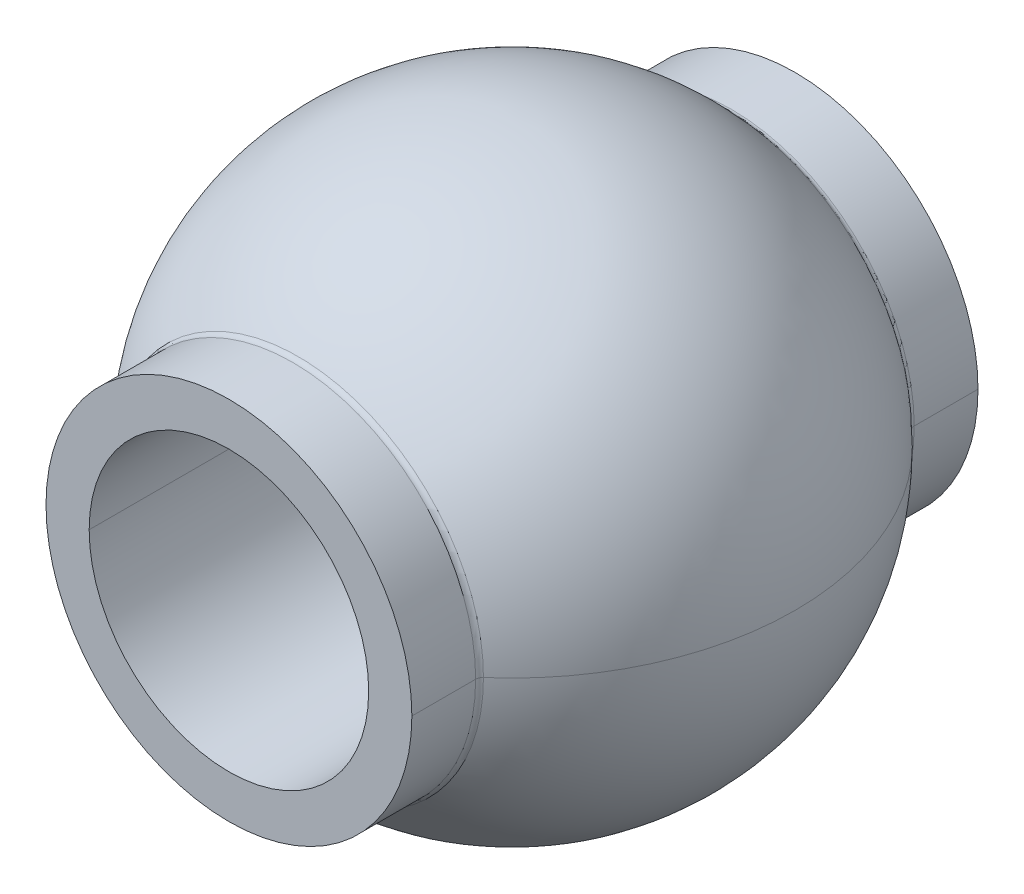
ISO-10303-21;
HEADER;
FILE_DESCRIPTION(('STEP AP214'),'2;1');
FILE_NAME('part.step','',(''),(''),'','','');
FILE_SCHEMA(('AUTOMOTIVE_DESIGN { 1 0 10303 214 1 1 1 1 }'));
ENDSEC;
DATA;
#1=APPLICATION_CONTEXT('core data for automotive mechanical design processes');
#2=APPLICATION_PROTOCOL_DEFINITION('international standard','automotive_design',2000,#1);
#3=PRODUCT_CONTEXT('',#1,'mechanical');
#4=PRODUCT('Part','Part','',(#3));
#5=PRODUCT_RELATED_PRODUCT_CATEGORY('part','',(#4));
#6=PRODUCT_DEFINITION_FORMATION('','',#4);
#7=PRODUCT_DEFINITION_CONTEXT('part definition',#1,'design');
#8=PRODUCT_DEFINITION('design','',#6,#7);
#9=PRODUCT_DEFINITION_SHAPE('','',#8);
#10=(LENGTH_UNIT() NAMED_UNIT(*) SI_UNIT(.MILLI.,.METRE.));
#11=(NAMED_UNIT(*) PLANE_ANGLE_UNIT() SI_UNIT($,.RADIAN.));
#12=(NAMED_UNIT(*) SI_UNIT($,.STERADIAN.) SOLID_ANGLE_UNIT());
#13=UNCERTAINTY_MEASURE_WITH_UNIT(LENGTH_MEASURE(1.E-05),#10,'distance_accuracy_value','');
#14=(GEOMETRIC_REPRESENTATION_CONTEXT(3) GLOBAL_UNCERTAINTY_ASSIGNED_CONTEXT((#13)) GLOBAL_UNIT_ASSIGNED_CONTEXT((#10,
#11,#12)) REPRESENTATION_CONTEXT('',''));
#15=CARTESIAN_POINT('',(0.,0.,0.));
#16=DIRECTION('',(0.,0.,1.));
#17=DIRECTION('',(1.,0.,0.));
#18=AXIS2_PLACEMENT_3D('',#15,#16,#17);
#19=CARTESIAN_POINT('',(0.,0.,-3.09851173952916));
#20=DIRECTION('',(0.,0.,1.));
#21=DIRECTION('',(1.,0.,0.));
#22=AXIS2_PLACEMENT_3D('',#19,#20,#21);
#23=TOROIDAL_SURFACE('',#22,2.685,0.1);
#24=CARTESIAN_POINT('',(0.,0.,-3.02293828246747));
#25=DIRECTION('',(0.,0.,1.));
#26=DIRECTION('',(1.,0.,0.));
#27=AXIS2_PLACEMENT_3D('',#24,#25,#26);
#28=CIRCLE('',#27,2.61951219512195);
#29=CARTESIAN_POINT('',(-2.61951219512195,0.,-3.02293828246747));
#30=VERTEX_POINT('',#29);
#31=CARTESIAN_POINT('',(2.61951219512195,0.,-3.02293828246747));
#32=VERTEX_POINT('',#31);
#33=EDGE_CURVE('E39',#30,#32,#28,.T.);
#34=ORIENTED_EDGE('',*,*,#33,.F.);
#35=CARTESIAN_POINT('',(-2.685,0.,-3.09851173952916));
#36=DIRECTION('',(0.,1.,0.));
#37=DIRECTION('',(-1.,0.,0.));
#38=AXIS2_PLACEMENT_3D('',#35,#36,#37);
#39=CIRCLE('',#38,0.1);
#40=CARTESIAN_POINT('',(-2.585,0.,-3.09851173952916));
#41=VERTEX_POINT('',#40);
#42=EDGE_CURVE('E11',#30,#41,#39,.T.);
#43=ORIENTED_EDGE('',*,*,#42,.T.);
#44=CARTESIAN_POINT('',(0.,0.,-3.09851173952916));
#45=DIRECTION('',(0.,0.,-1.));
#46=DIRECTION('',(1.,0.,0.));
#47=AXIS2_PLACEMENT_3D('',#44,#45,#46);
#48=CIRCLE('',#47,2.585);
#49=CARTESIAN_POINT('',(2.585,0.,-3.09851173952916));
#50=VERTEX_POINT('',#49);
#51=EDGE_CURVE('E20',#50,#41,#48,.T.);
#52=ORIENTED_EDGE('',*,*,#51,.F.);
#53=CARTESIAN_POINT('',(2.685,0.,-3.09851173952916));
#54=DIRECTION('',(0.,-1.,0.));
#55=DIRECTION('',(0.,0.,-1.));
#56=AXIS2_PLACEMENT_3D('',#53,#54,#55);
#57=CIRCLE('',#56,0.1);
#58=EDGE_CURVE('E108',#32,#50,#57,.T.);
#59=ORIENTED_EDGE('',*,*,#58,.F.);
#60=EDGE_LOOP('',(#34,#43,#52,#59));
#61=FACE_BOUND('',#60,.T.);
#62=ADVANCED_FACE('F16',(#61),#23,.F.);
#63=CARTESIAN_POINT('',(0.,0.,3.09851173952916));
#64=DIRECTION('',(0.,0.,-1.));
#65=DIRECTION('',(-1.,0.,0.));
#66=AXIS2_PLACEMENT_3D('',#63,#64,#65);
#67=TOROIDAL_SURFACE('',#66,2.685,0.1);
#68=CARTESIAN_POINT('',(0.,0.,3.02293828246747));
#69=DIRECTION('',(0.,0.,-1.));
#70=DIRECTION('',(-1.,0.,0.));
#71=AXIS2_PLACEMENT_3D('',#68,#69,#70);
#72=CIRCLE('',#71,2.61951219512195);
#73=CARTESIAN_POINT('',(2.61951219512195,0.,3.02293828246747));
#74=VERTEX_POINT('',#73);
#75=CARTESIAN_POINT('',(-2.61951219512195,0.,3.02293828246747));
#76=VERTEX_POINT('',#75);
#77=EDGE_CURVE('E145',#74,#76,#72,.T.);
#78=ORIENTED_EDGE('',*,*,#77,.F.);
#79=CARTESIAN_POINT('',(2.685,0.,3.09851173952916));
#80=DIRECTION('',(0.,1.,0.));
#81=DIRECTION('',(-1.,0.,0.));
#82=AXIS2_PLACEMENT_3D('',#79,#80,#81);
#83=CIRCLE('',#82,0.1);
#84=CARTESIAN_POINT('',(2.585,0.,3.09851173952916));
#85=VERTEX_POINT('',#84);
#86=EDGE_CURVE('E27',#74,#85,#83,.T.);
#87=ORIENTED_EDGE('',*,*,#86,.T.);
#88=CARTESIAN_POINT('',(0.,0.,3.09851173952916));
#89=DIRECTION('',(0.,0.,1.));
#90=DIRECTION('',(-1.,0.,0.));
#91=AXIS2_PLACEMENT_3D('',#88,#89,#90);
#92=CIRCLE('',#91,2.585);
#93=CARTESIAN_POINT('',(-2.585,0.,3.09851173952916));
#94=VERTEX_POINT('',#93);
#95=EDGE_CURVE('E120',#94,#85,#92,.T.);
#96=ORIENTED_EDGE('',*,*,#95,.F.);
#97=CARTESIAN_POINT('',(-2.685,0.,3.09851173952916));
#98=DIRECTION('',(0.,-1.,0.));
#99=DIRECTION('',(0.,0.,-1.));
#100=AXIS2_PLACEMENT_3D('',#97,#98,#99);
#101=CIRCLE('',#100,0.1);
#102=EDGE_CURVE('E110',#76,#94,#101,.T.);
#103=ORIENTED_EDGE('',*,*,#102,.F.);
#104=EDGE_LOOP('',(#78,#87,#96,#103));
#105=FACE_BOUND('',#104,.T.);
#106=ADVANCED_FACE('F241',(#105),#67,.F.);
#107=CARTESIAN_POINT('',(0.,0.,0.));
#108=DIRECTION('',(0.,0.,-1.));
#109=DIRECTION('',(-1.,0.,0.));
#110=AXIS2_PLACEMENT_3D('',#107,#108,#109);
#111=CYLINDRICAL_SURFACE('',#110,2.585);
#112=CARTESIAN_POINT('',(0.,0.,4.));
#113=DIRECTION('',(0.,0.,-1.));
#114=DIRECTION('',(-1.,0.,0.));
#115=AXIS2_PLACEMENT_3D('',#112,#113,#114);
#116=CIRCLE('',#115,2.585);
#117=CARTESIAN_POINT('',(-2.585,0.,4.));
#118=VERTEX_POINT('',#117);
#119=CARTESIAN_POINT('',(2.585,0.,4.));
#120=VERTEX_POINT('',#119);
#121=EDGE_CURVE('E167',#118,#120,#116,.T.);
#122=ORIENTED_EDGE('',*,*,#121,.T.);
#123=DIRECTION('',(0.,0.,-1.));
#124=VECTOR('',#123,1.);
#125=CARTESIAN_POINT('',(2.585,0.,0.));
#126=LINE('',#125,#124);
#127=EDGE_CURVE('E160',#120,#85,#126,.T.);
#128=ORIENTED_EDGE('',*,*,#127,.T.);
#129=CARTESIAN_POINT('',(0.,0.,3.09851173952916));
#130=DIRECTION('',(0.,0.,1.));
#131=DIRECTION('',(-1.,0.,0.));
#132=AXIS2_PLACEMENT_3D('',#129,#130,#131);
#133=CIRCLE('',#132,2.585);
#134=EDGE_CURVE('E156',#85,#94,#133,.T.);
#135=ORIENTED_EDGE('',*,*,#134,.T.);
#136=DIRECTION('',(0.,0.,-1.));
#137=VECTOR('',#136,1.);
#138=CARTESIAN_POINT('',(-2.585,0.,0.));
#139=LINE('',#138,#137);
#140=EDGE_CURVE('E136',#118,#94,#139,.T.);
#141=ORIENTED_EDGE('',*,*,#140,.F.);
#142=EDGE_LOOP('',(#122,#128,#135,#141));
#143=FACE_BOUND('',#142,.T.);
#144=ADVANCED_FACE('F224',(#143),#111,.T.);
#145=CARTESIAN_POINT('',(0.,0.,0.));
#146=DIRECTION('',(0.,0.,-1.));
#147=DIRECTION('',(-1.,0.,0.));
#148=AXIS2_PLACEMENT_3D('',#145,#146,#147);
#149=CYLINDRICAL_SURFACE('',#148,2.585);
#150=CARTESIAN_POINT('',(0.,0.,-3.09851173952916));
#151=DIRECTION('',(0.,0.,-1.));
#152=DIRECTION('',(1.,0.,0.));
#153=AXIS2_PLACEMENT_3D('',#150,#151,#152);
#154=CIRCLE('',#153,2.585);
#155=EDGE_CURVE('E144',#41,#50,#154,.T.);
#156=ORIENTED_EDGE('',*,*,#155,.T.);
#157=DIRECTION('',(0.,0.,-1.));
#158=VECTOR('',#157,1.);
#159=CARTESIAN_POINT('',(2.585,0.,0.));
#160=LINE('',#159,#158);
#161=CARTESIAN_POINT('',(2.585,0.,-4.));
#162=VERTEX_POINT('',#161);
#163=EDGE_CURVE('E141',#50,#162,#160,.T.);
#164=ORIENTED_EDGE('',*,*,#163,.T.);
#165=CARTESIAN_POINT('',(0.,0.,-4.));
#166=DIRECTION('',(0.,0.,-1.));
#167=DIRECTION('',(-1.,0.,0.));
#168=AXIS2_PLACEMENT_3D('',#165,#166,#167);
#169=CIRCLE('',#168,2.585);
#170=CARTESIAN_POINT('',(-2.585,0.,-4.));
#171=VERTEX_POINT('',#170);
#172=EDGE_CURVE('E111',#171,#162,#169,.T.);
#173=ORIENTED_EDGE('',*,*,#172,.F.);
#174=DIRECTION('',(0.,0.,-1.));
#175=VECTOR('',#174,1.);
#176=CARTESIAN_POINT('',(-2.585,0.,0.));
#177=LINE('',#176,#175);
#178=EDGE_CURVE('E151',#41,#171,#177,.T.);
#179=ORIENTED_EDGE('',*,*,#178,.F.);
#180=EDGE_LOOP('',(#156,#164,#173,#179));
#181=FACE_BOUND('',#180,.T.);
#182=ADVANCED_FACE('F249',(#181),#149,.T.);
#183=CARTESIAN_POINT('',(0.,0.,0.));
#184=DIRECTION('',(0.,-1.,0.));
#185=DIRECTION('',(1.,0.,0.));
#186=AXIS2_PLACEMENT_3D('',#183,#184,#185);
#187=SPHERICAL_SURFACE('',#186,4.);
#188=ORIENTED_EDGE('',*,*,#77,.T.);
#189=CARTESIAN_POINT('',(0.,0.,0.));
#190=DIRECTION('',(0.,-1.,0.));
#191=DIRECTION('',(1.,0.,0.));
#192=AXIS2_PLACEMENT_3D('',#189,#190,#191);
#193=CIRCLE('',#192,4.);
#194=EDGE_CURVE('E164',#76,#30,#193,.T.);
#195=ORIENTED_EDGE('',*,*,#194,.T.);
#196=ORIENTED_EDGE('',*,*,#33,.T.);
#197=CARTESIAN_POINT('',(0.,0.,0.));
#198=DIRECTION('',(0.,1.,0.));
#199=DIRECTION('',(0.,0.,1.));
#200=AXIS2_PLACEMENT_3D('',#197,#198,#199);
#201=CIRCLE('',#200,4.);
#202=EDGE_CURVE('E138',#74,#32,#201,.T.);
#203=ORIENTED_EDGE('',*,*,#202,.F.);
#204=EDGE_LOOP('',(#188,#195,#196,#203));
#205=FACE_BOUND('',#204,.T.);
#206=ADVANCED_FACE('F181',(#205),#187,.T.);
#207=CARTESIAN_POINT('',(0.,0.,0.));
#208=DIRECTION('',(0.,0.,-1.));
#209=DIRECTION('',(-1.,0.,0.));
#210=AXIS2_PLACEMENT_3D('',#207,#208,#209);
#211=CYLINDRICAL_SURFACE('',#210,1.975);
#212=CARTESIAN_POINT('',(0.,0.,4.));
#213=DIRECTION('',(0.,0.,1.));
#214=DIRECTION('',(-1.,0.,0.));
#215=AXIS2_PLACEMENT_3D('',#212,#213,#214);
#216=CIRCLE('',#215,1.975);
#217=CARTESIAN_POINT('',(-1.975,0.,4.));
#218=VERTEX_POINT('',#217);
#219=CARTESIAN_POINT('',(1.975,0.,4.));
#220=VERTEX_POINT('',#219);
#221=EDGE_CURVE('E77',#218,#220,#216,.T.);
#222=ORIENTED_EDGE('',*,*,#221,.T.);
#223=DIRECTION('',(0.,0.,-1.));
#224=VECTOR('',#223,1.);
#225=CARTESIAN_POINT('',(1.975,0.,0.));
#226=LINE('',#225,#224);
#227=CARTESIAN_POINT('',(1.975,0.,-4.));
#228=VERTEX_POINT('',#227);
#229=EDGE_CURVE('E92',#220,#228,#226,.T.);
#230=ORIENTED_EDGE('',*,*,#229,.T.);
#231=CARTESIAN_POINT('',(0.,0.,-4.));
#232=DIRECTION('',(0.,0.,1.));
#233=DIRECTION('',(-1.,0.,0.));
#234=AXIS2_PLACEMENT_3D('',#231,#232,#233);
#235=CIRCLE('',#234,1.975);
#236=CARTESIAN_POINT('',(-1.975,0.,-4.));
#237=VERTEX_POINT('',#236);
#238=EDGE_CURVE('E80',#237,#228,#235,.T.);
#239=ORIENTED_EDGE('',*,*,#238,.F.);
#240=DIRECTION('',(0.,0.,-1.));
#241=VECTOR('',#240,1.);
#242=CARTESIAN_POINT('',(-1.975,0.,0.));
#243=LINE('',#242,#241);
#244=EDGE_CURVE('E73',#218,#237,#243,.T.);
#245=ORIENTED_EDGE('',*,*,#244,.F.);
#246=EDGE_LOOP('',(#222,#230,#239,#245));
#247=FACE_BOUND('',#246,.T.);
#248=ADVANCED_FACE('F75',(#247),#211,.F.);
#249=CARTESIAN_POINT('',(0.,0.,0.));
#250=DIRECTION('',(0.,0.,-1.));
#251=DIRECTION('',(-1.,0.,0.));
#252=AXIS2_PLACEMENT_3D('',#249,#250,#251);
#253=CYLINDRICAL_SURFACE('',#252,1.975);
#254=ORIENTED_EDGE('',*,*,#229,.F.);
#255=CARTESIAN_POINT('',(0.,0.,4.));
#256=DIRECTION('',(0.,0.,1.));
#257=DIRECTION('',(-1.,0.,0.));
#258=AXIS2_PLACEMENT_3D('',#255,#256,#257);
#259=CIRCLE('',#258,1.975);
#260=EDGE_CURVE('E86',#220,#218,#259,.T.);
#261=ORIENTED_EDGE('',*,*,#260,.T.);
#262=ORIENTED_EDGE('',*,*,#244,.T.);
#263=CARTESIAN_POINT('',(0.,0.,-4.));
#264=DIRECTION('',(0.,0.,1.));
#265=DIRECTION('',(-1.,0.,0.));
#266=AXIS2_PLACEMENT_3D('',#263,#264,#265);
#267=CIRCLE('',#266,1.975);
#268=EDGE_CURVE('E148',#228,#237,#267,.T.);
#269=ORIENTED_EDGE('',*,*,#268,.F.);
#270=EDGE_LOOP('',(#254,#261,#262,#269));
#271=FACE_BOUND('',#270,.T.);
#272=ADVANCED_FACE('F95',(#271),#253,.F.);
#273=CARTESIAN_POINT('',(0.,0.,0.));
#274=DIRECTION('',(0.,-1.,0.));
#275=DIRECTION('',(1.,0.,0.));
#276=AXIS2_PLACEMENT_3D('',#273,#274,#275);
#277=SPHERICAL_SURFACE('',#276,4.);
#278=ORIENTED_EDGE('',*,*,#194,.F.);
#279=CARTESIAN_POINT('',(0.,0.,3.02293828246747));
#280=DIRECTION('',(0.,0.,-1.));
#281=DIRECTION('',(-1.,0.,0.));
#282=AXIS2_PLACEMENT_3D('',#279,#280,#281);
#283=CIRCLE('',#282,2.61951219512195);
#284=EDGE_CURVE('E87',#76,#74,#283,.T.);
#285=ORIENTED_EDGE('',*,*,#284,.T.);
#286=ORIENTED_EDGE('',*,*,#202,.T.);
#287=CARTESIAN_POINT('',(0.,0.,-3.02293828246747));
#288=DIRECTION('',(0.,0.,1.));
#289=DIRECTION('',(1.,0.,0.));
#290=AXIS2_PLACEMENT_3D('',#287,#288,#289);
#291=CIRCLE('',#290,2.61951219512195);
#292=EDGE_CURVE('E106',#32,#30,#291,.T.);
#293=ORIENTED_EDGE('',*,*,#292,.T.);
#294=EDGE_LOOP('',(#278,#285,#286,#293));
#295=FACE_BOUND('',#294,.T.);
#296=ADVANCED_FACE('F252',(#295),#277,.T.);
#297=CARTESIAN_POINT('',(0.,0.,0.));
#298=DIRECTION('',(0.,0.,-1.));
#299=DIRECTION('',(-1.,0.,0.));
#300=AXIS2_PLACEMENT_3D('',#297,#298,#299);
#301=CYLINDRICAL_SURFACE('',#300,2.585);
#302=ORIENTED_EDGE('',*,*,#163,.F.);
#303=ORIENTED_EDGE('',*,*,#51,.T.);
#304=ORIENTED_EDGE('',*,*,#178,.T.);
#305=CARTESIAN_POINT('',(0.,0.,-4.));
#306=DIRECTION('',(0.,0.,-1.));
#307=DIRECTION('',(-1.,0.,0.));
#308=AXIS2_PLACEMENT_3D('',#305,#306,#307);
#309=CIRCLE('',#308,2.585);
#310=EDGE_CURVE('E123',#162,#171,#309,.T.);
#311=ORIENTED_EDGE('',*,*,#310,.F.);
#312=EDGE_LOOP('',(#302,#303,#304,#311));
#313=FACE_BOUND('',#312,.T.);
#314=ADVANCED_FACE('F18',(#313),#301,.T.);
#315=CARTESIAN_POINT('',(0.,0.,0.));
#316=DIRECTION('',(0.,0.,-1.));
#317=DIRECTION('',(-1.,0.,0.));
#318=AXIS2_PLACEMENT_3D('',#315,#316,#317);
#319=CYLINDRICAL_SURFACE('',#318,2.585);
#320=ORIENTED_EDGE('',*,*,#127,.F.);
#321=CARTESIAN_POINT('',(0.,0.,4.));
#322=DIRECTION('',(0.,0.,-1.));
#323=DIRECTION('',(-1.,0.,0.));
#324=AXIS2_PLACEMENT_3D('',#321,#322,#323);
#325=CIRCLE('',#324,2.585);
#326=EDGE_CURVE('E154',#120,#118,#325,.T.);
#327=ORIENTED_EDGE('',*,*,#326,.T.);
#328=ORIENTED_EDGE('',*,*,#140,.T.);
#329=ORIENTED_EDGE('',*,*,#95,.T.);
#330=EDGE_LOOP('',(#320,#327,#328,#329));
#331=FACE_BOUND('',#330,.T.);
#332=ADVANCED_FACE('F218',(#331),#319,.T.);
#333=CARTESIAN_POINT('',(0.,0.,3.09851173952916));
#334=DIRECTION('',(0.,0.,-1.));
#335=DIRECTION('',(-1.,0.,0.));
#336=AXIS2_PLACEMENT_3D('',#333,#334,#335);
#337=TOROIDAL_SURFACE('',#336,2.685,0.1);
#338=ORIENTED_EDGE('',*,*,#86,.F.);
#339=ORIENTED_EDGE('',*,*,#284,.F.);
#340=ORIENTED_EDGE('',*,*,#102,.T.);
#341=ORIENTED_EDGE('',*,*,#134,.F.);
#342=EDGE_LOOP('',(#338,#339,#340,#341));
#343=FACE_BOUND('',#342,.T.);
#344=ADVANCED_FACE('F193',(#343),#337,.F.);
#345=CARTESIAN_POINT('',(0.,0.,-3.09851173952916));
#346=DIRECTION('',(0.,0.,1.));
#347=DIRECTION('',(1.,0.,0.));
#348=AXIS2_PLACEMENT_3D('',#345,#346,#347);
#349=TOROIDAL_SURFACE('',#348,2.685,0.1);
#350=ORIENTED_EDGE('',*,*,#42,.F.);
#351=ORIENTED_EDGE('',*,*,#292,.F.);
#352=ORIENTED_EDGE('',*,*,#58,.T.);
#353=ORIENTED_EDGE('',*,*,#155,.F.);
#354=EDGE_LOOP('',(#350,#351,#352,#353));
#355=FACE_BOUND('',#354,.T.);
#356=ADVANCED_FACE('F230',(#355),#349,.F.);
#357=CARTESIAN_POINT('',(0.,0.,4.));
#358=DIRECTION('',(0.,0.,-1.));
#359=DIRECTION('',(0.,-1.,0.));
#360=AXIS2_PLACEMENT_3D('',#357,#358,#359);
#361=PLANE('',#360);
#362=ORIENTED_EDGE('',*,*,#121,.F.);
#363=ORIENTED_EDGE('',*,*,#326,.F.);
#364=EDGE_LOOP('',(#362,#363));
#365=FACE_BOUND('',#364,.T.);
#366=ORIENTED_EDGE('',*,*,#221,.F.);
#367=ORIENTED_EDGE('',*,*,#260,.F.);
#368=EDGE_LOOP('',(#366,#367));
#369=FACE_BOUND('',#368,.T.);
#370=ADVANCED_FACE('F90',(#365,#369),#361,.F.);
#371=CARTESIAN_POINT('',(0.,0.,-4.));
#372=DIRECTION('',(0.,0.,-1.));
#373=DIRECTION('',(0.,-1.,0.));
#374=AXIS2_PLACEMENT_3D('',#371,#372,#373);
#375=PLANE('',#374);
#376=ORIENTED_EDGE('',*,*,#172,.T.);
#377=ORIENTED_EDGE('',*,*,#310,.T.);
#378=EDGE_LOOP('',(#376,#377));
#379=FACE_BOUND('',#378,.T.);
#380=ORIENTED_EDGE('',*,*,#238,.T.);
#381=ORIENTED_EDGE('',*,*,#268,.T.);
#382=EDGE_LOOP('',(#380,#381));
#383=FACE_BOUND('',#382,.T.);
#384=ADVANCED_FACE('F229',(#379,#383),#375,.T.);
#385=CLOSED_SHELL('',(#62,#106,#144,#182,#206,#248,#272,#296,#314,#332,#344,#356,#370,#384));
#386=MANIFOLD_SOLID_BREP('B1',#385);
#387=ADVANCED_BREP_SHAPE_REPRESENTATION('',(#18,#386),#14);
#388=SHAPE_DEFINITION_REPRESENTATION(#9,#387);
ENDSEC;
END-ISO-10303-21;
